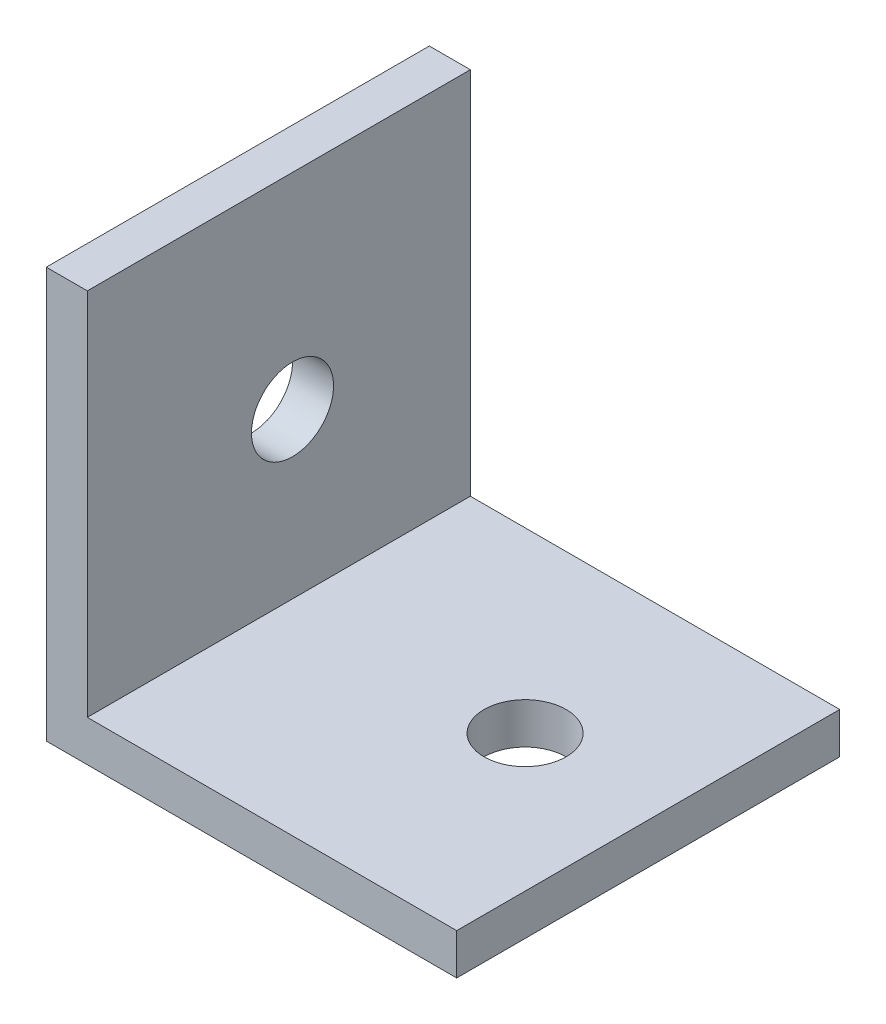
ISO-10303-21;
HEADER;
FILE_DESCRIPTION(('STEP AP214'),'2;1');
FILE_NAME('part.step','',(''),(''),'','','');
FILE_SCHEMA(('AUTOMOTIVE_DESIGN { 1 0 10303 214 1 1 1 1 }'));
ENDSEC;
DATA;
#1=APPLICATION_CONTEXT('core data for automotive mechanical design processes');
#2=APPLICATION_PROTOCOL_DEFINITION('international standard','automotive_design',2000,#1);
#3=PRODUCT_CONTEXT('',#1,'mechanical');
#4=PRODUCT('Part','Part','',(#3));
#5=PRODUCT_RELATED_PRODUCT_CATEGORY('part','',(#4));
#6=PRODUCT_DEFINITION_FORMATION('','',#4);
#7=PRODUCT_DEFINITION_CONTEXT('part definition',#1,'design');
#8=PRODUCT_DEFINITION('design','',#6,#7);
#9=PRODUCT_DEFINITION_SHAPE('','',#8);
#10=(LENGTH_UNIT() NAMED_UNIT(*) SI_UNIT(.MILLI.,.METRE.));
#11=(NAMED_UNIT(*) PLANE_ANGLE_UNIT() SI_UNIT($,.RADIAN.));
#12=(NAMED_UNIT(*) SI_UNIT($,.STERADIAN.) SOLID_ANGLE_UNIT());
#13=UNCERTAINTY_MEASURE_WITH_UNIT(LENGTH_MEASURE(1.E-05),#10,'distance_accuracy_value','');
#14=(GEOMETRIC_REPRESENTATION_CONTEXT(3) GLOBAL_UNCERTAINTY_ASSIGNED_CONTEXT((#13)) GLOBAL_UNIT_ASSIGNED_CONTEXT((#10,
#11,#12)) REPRESENTATION_CONTEXT('',''));
#15=CARTESIAN_POINT('',(0.,0.,0.));
#16=DIRECTION('',(0.,0.,1.));
#17=DIRECTION('',(1.,0.,0.));
#18=AXIS2_PLACEMENT_3D('',#15,#16,#17);
#19=CARTESIAN_POINT('',(-16.5444068349449,3.87231668437832,14.));
#20=DIRECTION('',(0.,-1.,0.));
#21=DIRECTION('',(1.,0.,0.));
#22=AXIS2_PLACEMENT_3D('',#19,#20,#21);
#23=PLANE('',#22);
#24=DIRECTION('',(-1.,0.,0.));
#25=VECTOR('',#24,1.);
#26=CARTESIAN_POINT('',(-16.5444068349449,3.87231668437832,0.));
#27=LINE('',#26,#25);
#28=CARTESIAN_POINT('',(-16.5444068349449,3.87231668437832,0.));
#29=VERTEX_POINT('',#28);
#30=CARTESIAN_POINT('',(-18.0444068349449,3.87231668437832,0.));
#31=VERTEX_POINT('',#30);
#32=EDGE_CURVE('E116',#29,#31,#27,.T.);
#33=ORIENTED_EDGE('',*,*,#32,.T.);
#34=DIRECTION('',(0.,0.,-1.));
#35=VECTOR('',#34,1.);
#36=CARTESIAN_POINT('',(-18.0444068349449,3.87231668437832,14.));
#37=LINE('',#36,#35);
#38=CARTESIAN_POINT('',(-18.0444068349449,3.87231668437832,14.));
#39=VERTEX_POINT('',#38);
#40=EDGE_CURVE('E11',#39,#31,#37,.T.);
#41=ORIENTED_EDGE('',*,*,#40,.F.);
#42=DIRECTION('',(-1.,0.,0.));
#43=VECTOR('',#42,1.);
#44=CARTESIAN_POINT('',(-16.5444068349449,3.87231668437832,14.));
#45=LINE('',#44,#43);
#46=CARTESIAN_POINT('',(-16.5444068349449,3.87231668437832,14.));
#47=VERTEX_POINT('',#46);
#48=EDGE_CURVE('E127',#47,#39,#45,.T.);
#49=ORIENTED_EDGE('',*,*,#48,.F.);
#50=DIRECTION('',(0.,0.,-1.));
#51=VECTOR('',#50,1.);
#52=CARTESIAN_POINT('',(-16.5444068349449,3.87231668437832,14.));
#53=LINE('',#52,#51);
#54=EDGE_CURVE('E112',#47,#29,#53,.T.);
#55=ORIENTED_EDGE('',*,*,#54,.T.);
#56=EDGE_LOOP('',(#33,#41,#49,#55));
#57=FACE_BOUND('',#56,.T.);
#58=ADVANCED_FACE('F31',(#57),#23,.F.);
#59=CARTESIAN_POINT('',(-18.0444068349449,3.87231668437832,14.));
#60=DIRECTION('',(1.,0.,0.));
#61=DIRECTION('',(0.,0.,-1.));
#62=AXIS2_PLACEMENT_3D('',#59,#60,#61);
#63=PLANE('',#62);
#64=CARTESIAN_POINT('',(-18.0444068349449,-3.62768331562168,6.5));
#65=DIRECTION('',(-1.,0.,0.));
#66=DIRECTION('',(0.,0.,1.));
#67=AXIS2_PLACEMENT_3D('',#64,#65,#66);
#68=CIRCLE('',#67,1.5);
#69=CARTESIAN_POINT('',(-18.0444068349449,-3.62768331562168,8.));
#70=VERTEX_POINT('',#69);
#71=EDGE_CURVE('E226',#70,#70,#68,.T.);
#72=ORIENTED_EDGE('',*,*,#71,.F.);
#73=EDGE_LOOP('',(#72));
#74=FACE_BOUND('',#73,.T.);
#75=DIRECTION('',(0.,-1.,0.));
#76=VECTOR('',#75,1.);
#77=CARTESIAN_POINT('',(-18.0444068349449,3.87231668437832,0.));
#78=LINE('',#77,#76);
#79=CARTESIAN_POINT('',(-18.0444068349449,-11.1276833156217,0.));
#80=VERTEX_POINT('',#79);
#81=EDGE_CURVE('E119',#31,#80,#78,.T.);
#82=ORIENTED_EDGE('',*,*,#81,.T.);
#83=DIRECTION('',(0.,0.,-1.));
#84=VECTOR('',#83,1.);
#85=CARTESIAN_POINT('',(-18.0444068349449,-11.1276833156217,14.));
#86=LINE('',#85,#84);
#87=CARTESIAN_POINT('',(-18.0444068349449,-11.1276833156217,14.));
#88=VERTEX_POINT('',#87);
#89=EDGE_CURVE('E40',#88,#80,#86,.T.);
#90=ORIENTED_EDGE('',*,*,#89,.F.);
#91=DIRECTION('',(0.,-1.,0.));
#92=VECTOR('',#91,1.);
#93=CARTESIAN_POINT('',(-18.0444068349449,3.87231668437832,14.));
#94=LINE('',#93,#92);
#95=EDGE_CURVE('E85',#39,#88,#94,.T.);
#96=ORIENTED_EDGE('',*,*,#95,.F.);
#97=ORIENTED_EDGE('',*,*,#40,.T.);
#98=EDGE_LOOP('',(#82,#90,#96,#97));
#99=FACE_BOUND('',#98,.T.);
#100=ADVANCED_FACE('F155',(#74,#99),#63,.F.);
#101=CARTESIAN_POINT('',(-18.0444068349449,-11.1276833156217,14.));
#102=DIRECTION('',(0.,1.,0.));
#103=DIRECTION('',(0.,0.,1.));
#104=AXIS2_PLACEMENT_3D('',#101,#102,#103);
#105=PLANE('',#104);
#106=CARTESIAN_POINT('',(-8.0444068349449,-11.1276833156217,6.5));
#107=DIRECTION('',(0.,1.,0.));
#108=DIRECTION('',(0.,0.,1.));
#109=AXIS2_PLACEMENT_3D('',#106,#107,#108);
#110=CIRCLE('',#109,1.5);
#111=CARTESIAN_POINT('',(-8.0444068349449,-11.1276833156217,8.));
#112=VERTEX_POINT('',#111);
#113=EDGE_CURVE('E120',#112,#112,#110,.T.);
#114=ORIENTED_EDGE('',*,*,#113,.T.);
#115=EDGE_LOOP('',(#114));
#116=FACE_BOUND('',#115,.T.);
#117=DIRECTION('',(1.,0.,0.));
#118=VECTOR('',#117,1.);
#119=CARTESIAN_POINT('',(-18.0444068349449,-11.1276833156217,0.));
#120=LINE('',#119,#118);
#121=CARTESIAN_POINT('',(-3.0444068349449,-11.1276833156217,0.));
#122=VERTEX_POINT('',#121);
#123=EDGE_CURVE('E122',#80,#122,#120,.T.);
#124=ORIENTED_EDGE('',*,*,#123,.T.);
#125=DIRECTION('',(0.,0.,-1.));
#126=VECTOR('',#125,1.);
#127=CARTESIAN_POINT('',(-3.0444068349449,-11.1276833156217,14.));
#128=LINE('',#127,#126);
#129=CARTESIAN_POINT('',(-3.0444068349449,-11.1276833156217,14.));
#130=VERTEX_POINT('',#129);
#131=EDGE_CURVE('E107',#130,#122,#128,.T.);
#132=ORIENTED_EDGE('',*,*,#131,.F.);
#133=DIRECTION('',(1.,0.,0.));
#134=VECTOR('',#133,1.);
#135=CARTESIAN_POINT('',(-18.0444068349449,-11.1276833156217,14.));
#136=LINE('',#135,#134);
#137=EDGE_CURVE('E98',#88,#130,#136,.T.);
#138=ORIENTED_EDGE('',*,*,#137,.F.);
#139=ORIENTED_EDGE('',*,*,#89,.T.);
#140=EDGE_LOOP('',(#124,#132,#138,#139));
#141=FACE_BOUND('',#140,.T.);
#142=ADVANCED_FACE('F134',(#116,#141),#105,.F.);
#143=CARTESIAN_POINT('',(-3.0444068349449,-11.1276833156217,14.));
#144=DIRECTION('',(-1.,0.,0.));
#145=DIRECTION('',(0.,0.,1.));
#146=AXIS2_PLACEMENT_3D('',#143,#144,#145);
#147=PLANE('',#146);
#148=DIRECTION('',(0.,1.,0.));
#149=VECTOR('',#148,1.);
#150=CARTESIAN_POINT('',(-3.0444068349449,-11.1276833156217,0.));
#151=LINE('',#150,#149);
#152=CARTESIAN_POINT('',(-3.0444068349449,-9.62768331562168,0.));
#153=VERTEX_POINT('',#152);
#154=EDGE_CURVE('E106',#122,#153,#151,.T.);
#155=ORIENTED_EDGE('',*,*,#154,.T.);
#156=DIRECTION('',(0.,0.,-1.));
#157=VECTOR('',#156,1.);
#158=CARTESIAN_POINT('',(-3.0444068349449,-9.62768331562168,14.));
#159=LINE('',#158,#157);
#160=CARTESIAN_POINT('',(-3.0444068349449,-9.62768331562168,14.));
#161=VERTEX_POINT('',#160);
#162=EDGE_CURVE('E103',#161,#153,#159,.T.);
#163=ORIENTED_EDGE('',*,*,#162,.F.);
#164=DIRECTION('',(0.,1.,0.));
#165=VECTOR('',#164,1.);
#166=CARTESIAN_POINT('',(-3.0444068349449,-11.1276833156217,14.));
#167=LINE('',#166,#165);
#168=EDGE_CURVE('E92',#130,#161,#167,.T.);
#169=ORIENTED_EDGE('',*,*,#168,.F.);
#170=ORIENTED_EDGE('',*,*,#131,.T.);
#171=EDGE_LOOP('',(#155,#163,#169,#170));
#172=FACE_BOUND('',#171,.T.);
#173=ADVANCED_FACE('F104',(#172),#147,.F.);
#174=CARTESIAN_POINT('',(-3.0444068349449,-9.62768331562168,14.));
#175=DIRECTION('',(0.,-1.,0.));
#176=DIRECTION('',(1.,0.,0.));
#177=AXIS2_PLACEMENT_3D('',#174,#175,#176);
#178=PLANE('',#177);
#179=CARTESIAN_POINT('',(-8.0444068349449,-9.62768331562168,6.5));
#180=DIRECTION('',(0.,1.,0.));
#181=DIRECTION('',(-1.,0.,0.));
#182=AXIS2_PLACEMENT_3D('',#179,#180,#181);
#183=CIRCLE('',#182,1.5);
#184=CARTESIAN_POINT('',(-9.54440683494491,-9.62768331562168,6.5));
#185=VERTEX_POINT('',#184);
#186=EDGE_CURVE('E228',#185,#185,#183,.T.);
#187=ORIENTED_EDGE('',*,*,#186,.F.);
#188=EDGE_LOOP('',(#187));
#189=FACE_BOUND('',#188,.T.);
#190=DIRECTION('',(-1.,0.,0.));
#191=VECTOR('',#190,1.);
#192=CARTESIAN_POINT('',(-3.0444068349449,-9.62768331562168,0.));
#193=LINE('',#192,#191);
#194=CARTESIAN_POINT('',(-16.5444068349449,-9.62768331562168,0.));
#195=VERTEX_POINT('',#194);
#196=EDGE_CURVE('E71',#153,#195,#193,.T.);
#197=ORIENTED_EDGE('',*,*,#196,.T.);
#198=DIRECTION('',(0.,0.,-1.));
#199=VECTOR('',#198,1.);
#200=CARTESIAN_POINT('',(-16.5444068349449,-9.62768331562168,14.));
#201=LINE('',#200,#199);
#202=CARTESIAN_POINT('',(-16.5444068349449,-9.62768331562168,14.));
#203=VERTEX_POINT('',#202);
#204=EDGE_CURVE('E108',#203,#195,#201,.T.);
#205=ORIENTED_EDGE('',*,*,#204,.F.);
#206=DIRECTION('',(-1.,0.,0.));
#207=VECTOR('',#206,1.);
#208=CARTESIAN_POINT('',(-3.0444068349449,-9.62768331562168,14.));
#209=LINE('',#208,#207);
#210=EDGE_CURVE('E96',#161,#203,#209,.T.);
#211=ORIENTED_EDGE('',*,*,#210,.F.);
#212=ORIENTED_EDGE('',*,*,#162,.T.);
#213=EDGE_LOOP('',(#197,#205,#211,#212));
#214=FACE_BOUND('',#213,.T.);
#215=ADVANCED_FACE('F110',(#189,#214),#178,.F.);
#216=CARTESIAN_POINT('',(-16.5444068349449,-9.62768331562168,14.));
#217=DIRECTION('',(-1.,0.,0.));
#218=DIRECTION('',(0.,0.,1.));
#219=AXIS2_PLACEMENT_3D('',#216,#217,#218);
#220=PLANE('',#219);
#221=CARTESIAN_POINT('',(-16.5444068349449,-3.62768331562168,6.5));
#222=DIRECTION('',(-1.,0.,0.));
#223=DIRECTION('',(0.,0.,1.));
#224=AXIS2_PLACEMENT_3D('',#221,#222,#223);
#225=CIRCLE('',#224,1.5);
#226=CARTESIAN_POINT('',(-16.5444068349449,-3.62768331562168,8.));
#227=VERTEX_POINT('',#226);
#228=EDGE_CURVE('E34',#227,#227,#225,.T.);
#229=ORIENTED_EDGE('',*,*,#228,.T.);
#230=EDGE_LOOP('',(#229));
#231=FACE_BOUND('',#230,.T.);
#232=DIRECTION('',(0.,1.,0.));
#233=VECTOR('',#232,1.);
#234=CARTESIAN_POINT('',(-16.5444068349449,-9.62768331562168,0.));
#235=LINE('',#234,#233);
#236=EDGE_CURVE('E77',#195,#29,#235,.T.);
#237=ORIENTED_EDGE('',*,*,#236,.T.);
#238=ORIENTED_EDGE('',*,*,#54,.F.);
#239=DIRECTION('',(0.,1.,0.));
#240=VECTOR('',#239,1.);
#241=CARTESIAN_POINT('',(-16.5444068349449,-9.62768331562168,14.));
#242=LINE('',#241,#240);
#243=EDGE_CURVE('E48',#203,#47,#242,.T.);
#244=ORIENTED_EDGE('',*,*,#243,.F.);
#245=ORIENTED_EDGE('',*,*,#204,.T.);
#246=EDGE_LOOP('',(#237,#238,#244,#245));
#247=FACE_BOUND('',#246,.T.);
#248=ADVANCED_FACE('F141',(#231,#247),#220,.F.);
#249=CARTESIAN_POINT('',(-18.0444068349449,3.87231668437832,14.));
#250=DIRECTION('',(0.,0.,1.));
#251=DIRECTION('',(1.,0.,0.));
#252=AXIS2_PLACEMENT_3D('',#249,#250,#251);
#253=PLANE('',#252);
#254=ORIENTED_EDGE('',*,*,#48,.T.);
#255=ORIENTED_EDGE('',*,*,#95,.T.);
#256=ORIENTED_EDGE('',*,*,#137,.T.);
#257=ORIENTED_EDGE('',*,*,#168,.T.);
#258=ORIENTED_EDGE('',*,*,#210,.T.);
#259=ORIENTED_EDGE('',*,*,#243,.T.);
#260=EDGE_LOOP('',(#254,#255,#256,#257,#258,#259));
#261=FACE_BOUND('',#260,.T.);
#262=ADVANCED_FACE('F94',(#261),#253,.T.);
#263=CARTESIAN_POINT('',(-18.0444068349449,3.87231668437832,0.));
#264=DIRECTION('',(0.,0.,1.));
#265=DIRECTION('',(1.,0.,0.));
#266=AXIS2_PLACEMENT_3D('',#263,#264,#265);
#267=PLANE('',#266);
#268=ORIENTED_EDGE('',*,*,#32,.F.);
#269=ORIENTED_EDGE('',*,*,#236,.F.);
#270=ORIENTED_EDGE('',*,*,#196,.F.);
#271=ORIENTED_EDGE('',*,*,#154,.F.);
#272=ORIENTED_EDGE('',*,*,#123,.F.);
#273=ORIENTED_EDGE('',*,*,#81,.F.);
#274=EDGE_LOOP('',(#268,#269,#270,#271,#272,#273));
#275=FACE_BOUND('',#274,.T.);
#276=ADVANCED_FACE('F137',(#275),#267,.F.);
#277=CARTESIAN_POINT('',(-8.0444068349449,-23.6276833156217,6.5));
#278=DIRECTION('',(0.,1.,0.));
#279=DIRECTION('',(-1.,0.,0.));
#280=AXIS2_PLACEMENT_3D('',#277,#278,#279);
#281=CYLINDRICAL_SURFACE('',#280,1.5);
#282=ORIENTED_EDGE('',*,*,#186,.T.);
#283=EDGE_LOOP('',(#282));
#284=FACE_BOUND('',#283,.T.);
#285=ORIENTED_EDGE('',*,*,#113,.F.);
#286=EDGE_LOOP('',(#285));
#287=FACE_BOUND('',#286,.T.);
#288=ADVANCED_FACE('F186',(#284,#287),#281,.F.);
#289=CARTESIAN_POINT('',(-4.0444068349449,-3.62768331562168,6.5));
#290=DIRECTION('',(-1.,0.,0.));
#291=DIRECTION('',(0.,0.,1.));
#292=AXIS2_PLACEMENT_3D('',#289,#290,#291);
#293=CYLINDRICAL_SURFACE('',#292,1.5);
#294=ORIENTED_EDGE('',*,*,#71,.T.);
#295=EDGE_LOOP('',(#294));
#296=FACE_BOUND('',#295,.T.);
#297=ORIENTED_EDGE('',*,*,#228,.F.);
#298=EDGE_LOOP('',(#297));
#299=FACE_BOUND('',#298,.T.);
#300=ADVANCED_FACE('F190',(#296,#299),#293,.F.);
#301=CLOSED_SHELL('',(#58,#100,#142,#173,#215,#248,#262,#276,#288,#300));
#302=MANIFOLD_SOLID_BREP('B2',#301);
#303=ADVANCED_BREP_SHAPE_REPRESENTATION('',(#18,#302),#14);
#304=SHAPE_DEFINITION_REPRESENTATION(#9,#303);
ENDSEC;
END-ISO-10303-21;
